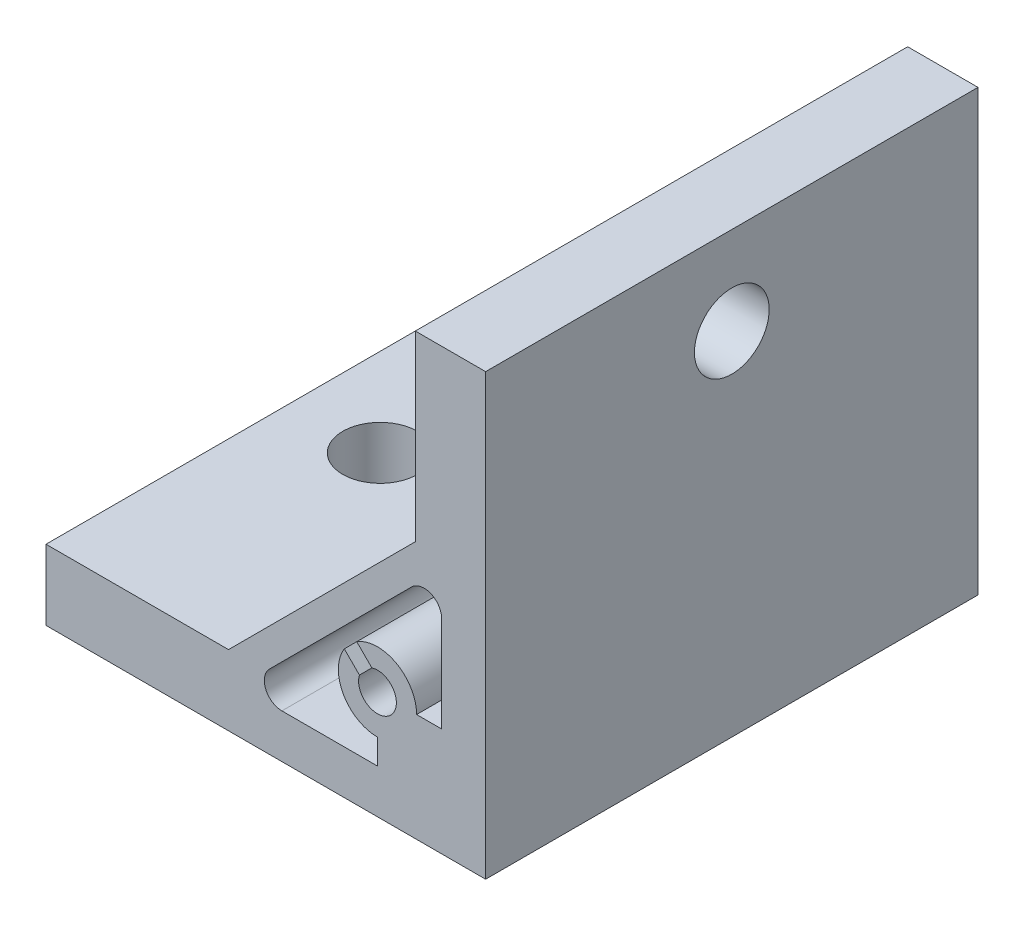
ISO-10303-21;
HEADER;
FILE_DESCRIPTION(('STEP AP214'),'2;1');
FILE_NAME('part.step','',(''),(''),'','','');
FILE_SCHEMA(('AUTOMOTIVE_DESIGN { 1 0 10303 214 1 1 1 1 }'));
ENDSEC;
DATA;
#1=APPLICATION_CONTEXT('core data for automotive mechanical design processes');
#2=APPLICATION_PROTOCOL_DEFINITION('international standard','automotive_design',2000,#1);
#3=PRODUCT_CONTEXT('',#1,'mechanical');
#4=PRODUCT('Part','Part','',(#3));
#5=PRODUCT_RELATED_PRODUCT_CATEGORY('part','',(#4));
#6=PRODUCT_DEFINITION_FORMATION('','',#4);
#7=PRODUCT_DEFINITION_CONTEXT('part definition',#1,'design');
#8=PRODUCT_DEFINITION('design','',#6,#7);
#9=PRODUCT_DEFINITION_SHAPE('','',#8);
#10=(LENGTH_UNIT() NAMED_UNIT(*) SI_UNIT(.MILLI.,.METRE.));
#11=(NAMED_UNIT(*) PLANE_ANGLE_UNIT() SI_UNIT($,.RADIAN.));
#12=(NAMED_UNIT(*) SI_UNIT($,.STERADIAN.) SOLID_ANGLE_UNIT());
#13=UNCERTAINTY_MEASURE_WITH_UNIT(LENGTH_MEASURE(1.E-05),#10,'distance_accuracy_value','');
#14=(GEOMETRIC_REPRESENTATION_CONTEXT(3) GLOBAL_UNCERTAINTY_ASSIGNED_CONTEXT((#13)) GLOBAL_UNIT_ASSIGNED_CONTEXT((#10,
#11,#12)) REPRESENTATION_CONTEXT('',''));
#15=CARTESIAN_POINT('',(0.,0.,0.));
#16=DIRECTION('',(0.,0.,1.));
#17=DIRECTION('',(1.,0.,0.));
#18=AXIS2_PLACEMENT_3D('',#15,#16,#17);
#19=CARTESIAN_POINT('',(50.,0.,28.));
#20=DIRECTION('',(-1.,0.,0.));
#21=DIRECTION('',(0.,0.,1.));
#22=AXIS2_PLACEMENT_3D('',#19,#20,#21);
#23=PLANE('',#22);
#24=DIRECTION('',(0.,1.,0.));
#25=VECTOR('',#24,1.);
#26=CARTESIAN_POINT('',(50.,0.,-28.));
#27=LINE('',#26,#25);
#28=CARTESIAN_POINT('',(50.,0.,-28.));
#29=VERTEX_POINT('',#28);
#30=CARTESIAN_POINT('',(50.,50.,-28.));
#31=VERTEX_POINT('',#30);
#32=EDGE_CURVE('E283',#29,#31,#27,.T.);
#33=ORIENTED_EDGE('',*,*,#32,.T.);
#34=DIRECTION('',(0.,0.,-1.));
#35=VECTOR('',#34,1.);
#36=CARTESIAN_POINT('',(50.,50.,28.));
#37=LINE('',#36,#35);
#38=CARTESIAN_POINT('',(50.,50.,28.));
#39=VERTEX_POINT('',#38);
#40=EDGE_CURVE('E303',#39,#31,#37,.T.);
#41=ORIENTED_EDGE('',*,*,#40,.F.);
#42=DIRECTION('',(0.,1.,0.));
#43=VECTOR('',#42,1.);
#44=CARTESIAN_POINT('',(50.,0.,28.));
#45=LINE('',#44,#43);
#46=CARTESIAN_POINT('',(50.,0.,28.));
#47=VERTEX_POINT('',#46);
#48=EDGE_CURVE('E268',#47,#39,#45,.T.);
#49=ORIENTED_EDGE('',*,*,#48,.F.);
#50=DIRECTION('',(0.,0.,-1.));
#51=VECTOR('',#50,1.);
#52=CARTESIAN_POINT('',(50.,0.,28.));
#53=LINE('',#52,#51);
#54=EDGE_CURVE('E43',#47,#29,#53,.T.);
#55=ORIENTED_EDGE('',*,*,#54,.T.);
#56=EDGE_LOOP('',(#33,#41,#49,#55));
#57=FACE_BOUND('',#56,.T.);
#58=CARTESIAN_POINT('',(50.0000000000001,40.,0.));
#59=DIRECTION('',(1.,0.,0.));
#60=DIRECTION('',(0.,0.,1.));
#61=AXIS2_PLACEMENT_3D('',#58,#59,#60);
#62=CIRCLE('',#61,4.25);
#63=CARTESIAN_POINT('',(50.0000000000001,40.,4.25));
#64=VERTEX_POINT('',#63);
#65=EDGE_CURVE('E369',#64,#64,#62,.T.);
#66=ORIENTED_EDGE('',*,*,#65,.F.);
#67=EDGE_LOOP('',(#66));
#68=FACE_BOUND('',#67,.T.);
#69=ADVANCED_FACE('F35',(#57,#68),#23,.F.);
#70=CARTESIAN_POINT('',(42.,29.2426406871192,28.));
#71=DIRECTION('',(1.,0.,0.));
#72=DIRECTION('',(0.,0.,-1.));
#73=AXIS2_PLACEMENT_3D('',#70,#71,#72);
#74=PLANE('',#73);
#75=DIRECTION('',(0.,-1.,0.));
#76=VECTOR('',#75,1.);
#77=CARTESIAN_POINT('',(42.,29.2426406871192,-28.));
#78=LINE('',#77,#76);
#79=CARTESIAN_POINT('',(42.,50.,-28.));
#80=VERTEX_POINT('',#79);
#81=CARTESIAN_POINT('',(42.,29.2426406871192,-28.));
#82=VERTEX_POINT('',#81);
#83=EDGE_CURVE('E287',#80,#82,#78,.T.);
#84=ORIENTED_EDGE('',*,*,#83,.T.);
#85=DIRECTION('',(0.,0.,-1.));
#86=VECTOR('',#85,1.);
#87=CARTESIAN_POINT('',(42.,29.2426406871192,28.));
#88=LINE('',#87,#86);
#89=CARTESIAN_POINT('',(42.,29.2426406871192,28.));
#90=VERTEX_POINT('',#89);
#91=EDGE_CURVE('E297',#90,#82,#88,.T.);
#92=ORIENTED_EDGE('',*,*,#91,.F.);
#93=DIRECTION('',(0.,-1.,0.));
#94=VECTOR('',#93,1.);
#95=CARTESIAN_POINT('',(42.,29.2426406871192,28.));
#96=LINE('',#95,#94);
#97=CARTESIAN_POINT('',(42.,50.,28.));
#98=VERTEX_POINT('',#97);
#99=EDGE_CURVE('E272',#98,#90,#96,.T.);
#100=ORIENTED_EDGE('',*,*,#99,.F.);
#101=DIRECTION('',(0.,0.,-1.));
#102=VECTOR('',#101,1.);
#103=CARTESIAN_POINT('',(42.,50.,28.));
#104=LINE('',#103,#102);
#105=EDGE_CURVE('E300',#98,#80,#104,.T.);
#106=ORIENTED_EDGE('',*,*,#105,.T.);
#107=EDGE_LOOP('',(#84,#92,#100,#106));
#108=FACE_BOUND('',#107,.T.);
#109=CARTESIAN_POINT('',(42.0000000000001,40.,0.));
#110=DIRECTION('',(1.,0.,0.));
#111=DIRECTION('',(0.,0.,1.));
#112=AXIS2_PLACEMENT_3D('',#109,#110,#111);
#113=CIRCLE('',#112,4.25);
#114=CARTESIAN_POINT('',(42.0000000000001,40.,4.25));
#115=VERTEX_POINT('',#114);
#116=EDGE_CURVE('E371',#115,#115,#113,.T.);
#117=ORIENTED_EDGE('',*,*,#116,.T.);
#118=EDGE_LOOP('',(#117));
#119=FACE_BOUND('',#118,.T.);
#120=ADVANCED_FACE('F326',(#108,#119),#74,.F.);
#121=CARTESIAN_POINT('',(0.,0.,28.));
#122=DIRECTION('',(0.,0.,1.));
#123=DIRECTION('',(1.,0.,0.));
#124=AXIS2_PLACEMENT_3D('',#121,#122,#123);
#125=PLANE('',#124);
#126=DIRECTION('',(0.,-1.,0.));
#127=VECTOR('',#126,1.);
#128=CARTESIAN_POINT('',(0.,8.,28.));
#129=LINE('',#128,#127);
#130=CARTESIAN_POINT('',(0.,8.,28.));
#131=VERTEX_POINT('',#130);
#132=CARTESIAN_POINT('',(0.,0.,28.));
#133=VERTEX_POINT('',#132);
#134=EDGE_CURVE('E262',#131,#133,#129,.T.);
#135=ORIENTED_EDGE('',*,*,#134,.T.);
#136=DIRECTION('',(1.,0.,0.));
#137=VECTOR('',#136,1.);
#138=CARTESIAN_POINT('',(0.,0.,28.));
#139=LINE('',#138,#137);
#140=EDGE_CURVE('E265',#133,#47,#139,.T.);
#141=ORIENTED_EDGE('',*,*,#140,.T.);
#142=ORIENTED_EDGE('',*,*,#48,.T.);
#143=DIRECTION('',(-1.,0.,0.));
#144=VECTOR('',#143,1.);
#145=CARTESIAN_POINT('',(42.,50.,28.));
#146=LINE('',#145,#144);
#147=EDGE_CURVE('E270',#39,#98,#146,.T.);
#148=ORIENTED_EDGE('',*,*,#147,.T.);
#149=ORIENTED_EDGE('',*,*,#99,.T.);
#150=DIRECTION('',(-0.707106781186546,-0.707106781186549,0.));
#151=VECTOR('',#150,1.);
#152=CARTESIAN_POINT('',(20.7573593128809,8.,28.));
#153=LINE('',#152,#151);
#154=CARTESIAN_POINT('',(20.7573593128809,8.,28.));
#155=VERTEX_POINT('',#154);
#156=EDGE_CURVE('E274',#90,#155,#153,.T.);
#157=ORIENTED_EDGE('',*,*,#156,.T.);
#158=DIRECTION('',(-1.,0.,0.));
#159=VECTOR('',#158,1.);
#160=CARTESIAN_POINT('',(0.,8.,28.));
#161=LINE('',#160,#159);
#162=EDGE_CURVE('E276',#155,#131,#161,.T.);
#163=ORIENTED_EDGE('',*,*,#162,.T.);
#164=EDGE_LOOP('',(#135,#141,#142,#148,#149,#157,#163));
#165=FACE_BOUND('',#164,.T.);
#166=DIRECTION('',(0.707106781186549,-0.707106781186546,0.));
#167=VECTOR('',#166,1.);
#168=CARTESIAN_POINT('',(35.647066335444,12.9387201021829,28.));
#169=LINE('',#168,#167);
#170=CARTESIAN_POINT('',(33.9267474297161,14.6590390079109,28.));
#171=VERTEX_POINT('',#170);
#172=CARTESIAN_POINT('',(35.647066335444,12.9387201021829,28.));
#173=VERTEX_POINT('',#172);
#174=EDGE_CURVE('E174',#171,#173,#169,.T.);
#175=ORIENTED_EDGE('',*,*,#174,.F.);
#176=CARTESIAN_POINT('',(37.7,12.3,28.));
#177=DIRECTION('',(0.,0.,-1.));
#178=DIRECTION('',(1.,0.,0.));
#179=AXIS2_PLACEMENT_3D('',#176,#177,#178);
#180=CIRCLE('',#179,4.45);
#181=CARTESIAN_POINT('',(37.7,7.84999999999995,28.));
#182=VERTEX_POINT('',#181);
#183=EDGE_CURVE('E166',#182,#171,#180,.T.);
#184=ORIENTED_EDGE('',*,*,#183,.F.);
#185=DIRECTION('',(0.,1.,0.));
#186=VECTOR('',#185,1.);
#187=CARTESIAN_POINT('',(37.7,5.,28.));
#188=LINE('',#187,#186);
#189=CARTESIAN_POINT('',(37.7,5.,28.));
#190=VERTEX_POINT('',#189);
#191=EDGE_CURVE('E209',#190,#182,#188,.T.);
#192=ORIENTED_EDGE('',*,*,#191,.F.);
#193=DIRECTION('',(1.,0.,0.));
#194=VECTOR('',#193,1.);
#195=CARTESIAN_POINT('',(26.828427124746,5.,28.));
#196=LINE('',#195,#194);
#197=CARTESIAN_POINT('',(26.828427124746,4.99999999999993,28.));
#198=VERTEX_POINT('',#197);
#199=EDGE_CURVE('E207',#198,#190,#196,.T.);
#200=ORIENTED_EDGE('',*,*,#199,.F.);
#201=CARTESIAN_POINT('',(26.8284271247464,7.00000000000011,28.));
#202=DIRECTION('',(0.,0.,1.));
#203=DIRECTION('',(1.,0.,0.));
#204=AXIS2_PLACEMENT_3D('',#201,#202,#203);
#205=CIRCLE('',#204,2.00000000000019);
#206=CARTESIAN_POINT('',(25.4142135623729,8.41421356237311,28.));
#207=VERTEX_POINT('',#206);
#208=EDGE_CURVE('E205',#207,#198,#205,.T.);
#209=ORIENTED_EDGE('',*,*,#208,.F.);
#210=DIRECTION('',(-0.70710678118655,-0.707106781186545,0.));
#211=VECTOR('',#210,1.);
#212=CARTESIAN_POINT('',(25.4142135623729,8.41421356237311,28.));
#213=LINE('',#212,#211);
#214=CARTESIAN_POINT('',(41.585786437627,24.5857864376269,28.));
#215=VERTEX_POINT('',#214);
#216=EDGE_CURVE('E203',#215,#207,#213,.T.);
#217=ORIENTED_EDGE('',*,*,#216,.F.);
#218=CARTESIAN_POINT('',(43.0000000000002,23.171572875254,28.));
#219=DIRECTION('',(0.,0.,1.));
#220=DIRECTION('',(1.,0.,0.));
#221=AXIS2_PLACEMENT_3D('',#218,#219,#220);
#222=CIRCLE('',#221,1.99999999999993);
#223=CARTESIAN_POINT('',(45.,23.1715728752539,28.));
#224=VERTEX_POINT('',#223);
#225=EDGE_CURVE('E201',#224,#215,#222,.T.);
#226=ORIENTED_EDGE('',*,*,#225,.F.);
#227=DIRECTION('',(0.,1.,0.));
#228=VECTOR('',#227,1.);
#229=CARTESIAN_POINT('',(45.,23.1715728752539,28.));
#230=LINE('',#229,#228);
#231=CARTESIAN_POINT('',(45.,12.3,28.));
#232=VERTEX_POINT('',#231);
#233=EDGE_CURVE('E199',#232,#224,#230,.T.);
#234=ORIENTED_EDGE('',*,*,#233,.F.);
#235=DIRECTION('',(1.,0.,0.));
#236=VECTOR('',#235,1.);
#237=CARTESIAN_POINT('',(42.15,12.3,28.));
#238=LINE('',#237,#236);
#239=CARTESIAN_POINT('',(42.15,12.3,28.));
#240=VERTEX_POINT('',#239);
#241=EDGE_CURVE('E197',#240,#232,#238,.T.);
#242=ORIENTED_EDGE('',*,*,#241,.F.);
#243=CARTESIAN_POINT('',(37.7,12.3,28.));
#244=DIRECTION('',(0.,0.,-1.));
#245=DIRECTION('',(1.,0.,0.));
#246=AXIS2_PLACEMENT_3D('',#243,#244,#245);
#247=CIRCLE('',#246,4.45);
#248=CARTESIAN_POINT('',(35.3409609920885,16.0732525702836,28.));
#249=VERTEX_POINT('',#248);
#250=EDGE_CURVE('E195',#249,#240,#247,.T.);
#251=ORIENTED_EDGE('',*,*,#250,.F.);
#252=DIRECTION('',(-0.707106781186684,0.707106781186411,0.));
#253=VECTOR('',#252,1.);
#254=CARTESIAN_POINT('',(37.0612798978168,14.3529336645559,28.));
#255=LINE('',#254,#253);
#256=CARTESIAN_POINT('',(37.0612798978168,14.3529336645559,28.));
#257=VERTEX_POINT('',#256);
#258=EDGE_CURVE('E190',#257,#249,#255,.T.);
#259=ORIENTED_EDGE('',*,*,#258,.F.);
#260=CARTESIAN_POINT('',(37.7,12.3,28.));
#261=DIRECTION('',(0.,0.,1.));
#262=DIRECTION('',(1.,0.,0.));
#263=AXIS2_PLACEMENT_3D('',#260,#261,#262);
#264=CIRCLE('',#263,2.15);
#265=EDGE_CURVE('E188',#173,#257,#264,.T.);
#266=ORIENTED_EDGE('',*,*,#265,.F.);
#267=EDGE_LOOP('',(#175,#184,#192,#200,#209,#217,#226,#234,#242,#251,#259,#266));
#268=FACE_BOUND('',#267,.T.);
#269=ADVANCED_FACE('F186',(#165,#268),#125,.T.);
#270=CARTESIAN_POINT('',(0.,0.,-28.));
#271=DIRECTION('',(0.,0.,1.));
#272=DIRECTION('',(1.,0.,0.));
#273=AXIS2_PLACEMENT_3D('',#270,#271,#272);
#274=PLANE('',#273);
#275=DIRECTION('',(0.,-1.,0.));
#276=VECTOR('',#275,1.);
#277=CARTESIAN_POINT('',(0.,8.,-28.));
#278=LINE('',#277,#276);
#279=CARTESIAN_POINT('',(0.,8.,-28.));
#280=VERTEX_POINT('',#279);
#281=CARTESIAN_POINT('',(0.,0.,-28.));
#282=VERTEX_POINT('',#281);
#283=EDGE_CURVE('E182',#280,#282,#278,.T.);
#284=ORIENTED_EDGE('',*,*,#283,.F.);
#285=DIRECTION('',(-1.,0.,0.));
#286=VECTOR('',#285,1.);
#287=CARTESIAN_POINT('',(0.,8.,-28.));
#288=LINE('',#287,#286);
#289=CARTESIAN_POINT('',(20.7573593128809,8.,-28.));
#290=VERTEX_POINT('',#289);
#291=EDGE_CURVE('E266',#290,#280,#288,.T.);
#292=ORIENTED_EDGE('',*,*,#291,.F.);
#293=DIRECTION('',(-0.707106781186546,-0.707106781186549,0.));
#294=VECTOR('',#293,1.);
#295=CARTESIAN_POINT('',(20.7573593128809,8.,-28.));
#296=LINE('',#295,#294);
#297=EDGE_CURVE('E289',#82,#290,#296,.T.);
#298=ORIENTED_EDGE('',*,*,#297,.F.);
#299=ORIENTED_EDGE('',*,*,#83,.F.);
#300=DIRECTION('',(-1.,0.,0.));
#301=VECTOR('',#300,1.);
#302=CARTESIAN_POINT('',(42.,50.,-28.));
#303=LINE('',#302,#301);
#304=EDGE_CURVE('E285',#31,#80,#303,.T.);
#305=ORIENTED_EDGE('',*,*,#304,.F.);
#306=ORIENTED_EDGE('',*,*,#32,.F.);
#307=DIRECTION('',(1.,0.,0.));
#308=VECTOR('',#307,1.);
#309=CARTESIAN_POINT('',(0.,0.,-28.));
#310=LINE('',#309,#308);
#311=EDGE_CURVE('E281',#282,#29,#310,.T.);
#312=ORIENTED_EDGE('',*,*,#311,.F.);
#313=EDGE_LOOP('',(#284,#292,#298,#299,#305,#306,#312));
#314=FACE_BOUND('',#313,.T.);
#315=CARTESIAN_POINT('',(37.7,12.3,-28.));
#316=DIRECTION('',(0.,0.,-1.));
#317=DIRECTION('',(1.,0.,0.));
#318=AXIS2_PLACEMENT_3D('',#315,#316,#317);
#319=CIRCLE('',#318,4.45);
#320=CARTESIAN_POINT('',(37.7,7.84999999999995,-28.));
#321=VERTEX_POINT('',#320);
#322=CARTESIAN_POINT('',(33.9267474297161,14.6590390079109,-28.));
#323=VERTEX_POINT('',#322);
#324=EDGE_CURVE('E58',#321,#323,#319,.T.);
#325=ORIENTED_EDGE('',*,*,#324,.T.);
#326=DIRECTION('',(0.707106781186549,-0.707106781186546,0.));
#327=VECTOR('',#326,1.);
#328=CARTESIAN_POINT('',(35.647066335444,12.9387201021829,-28.));
#329=LINE('',#328,#327);
#330=CARTESIAN_POINT('',(35.647066335444,12.9387201021829,-28.));
#331=VERTEX_POINT('',#330);
#332=EDGE_CURVE('E181',#323,#331,#329,.T.);
#333=ORIENTED_EDGE('',*,*,#332,.T.);
#334=CARTESIAN_POINT('',(37.7,12.3,-28.));
#335=DIRECTION('',(0.,0.,1.));
#336=DIRECTION('',(1.,0.,0.));
#337=AXIS2_PLACEMENT_3D('',#334,#335,#336);
#338=CIRCLE('',#337,2.15);
#339=CARTESIAN_POINT('',(37.0612798978168,14.3529336645559,-28.));
#340=VERTEX_POINT('',#339);
#341=EDGE_CURVE('E214',#331,#340,#338,.T.);
#342=ORIENTED_EDGE('',*,*,#341,.T.);
#343=DIRECTION('',(-0.707106781186684,0.707106781186411,0.));
#344=VECTOR('',#343,1.);
#345=CARTESIAN_POINT('',(37.0612798978168,14.3529336645559,-28.));
#346=LINE('',#345,#344);
#347=CARTESIAN_POINT('',(35.3409609920885,16.0732525702836,-28.));
#348=VERTEX_POINT('',#347);
#349=EDGE_CURVE('E217',#340,#348,#346,.T.);
#350=ORIENTED_EDGE('',*,*,#349,.T.);
#351=CARTESIAN_POINT('',(37.7,12.3,-28.));
#352=DIRECTION('',(0.,0.,-1.));
#353=DIRECTION('',(1.,0.,0.));
#354=AXIS2_PLACEMENT_3D('',#351,#352,#353);
#355=CIRCLE('',#354,4.45);
#356=CARTESIAN_POINT('',(42.15,12.3,-28.));
#357=VERTEX_POINT('',#356);
#358=EDGE_CURVE('E220',#348,#357,#355,.T.);
#359=ORIENTED_EDGE('',*,*,#358,.T.);
#360=DIRECTION('',(1.,0.,0.));
#361=VECTOR('',#360,1.);
#362=CARTESIAN_POINT('',(42.15,12.3,-28.));
#363=LINE('',#362,#361);
#364=CARTESIAN_POINT('',(45.,12.3,-28.));
#365=VERTEX_POINT('',#364);
#366=EDGE_CURVE('E223',#357,#365,#363,.T.);
#367=ORIENTED_EDGE('',*,*,#366,.T.);
#368=DIRECTION('',(0.,1.,0.));
#369=VECTOR('',#368,1.);
#370=CARTESIAN_POINT('',(45.,23.1715728752539,-28.));
#371=LINE('',#370,#369);
#372=CARTESIAN_POINT('',(45.,23.1715728752539,-28.));
#373=VERTEX_POINT('',#372);
#374=EDGE_CURVE('E226',#365,#373,#371,.T.);
#375=ORIENTED_EDGE('',*,*,#374,.T.);
#376=CARTESIAN_POINT('',(43.0000000000002,23.171572875254,-28.));
#377=DIRECTION('',(0.,0.,1.));
#378=DIRECTION('',(1.,0.,0.));
#379=AXIS2_PLACEMENT_3D('',#376,#377,#378);
#380=CIRCLE('',#379,1.99999999999993);
#381=CARTESIAN_POINT('',(41.585786437627,24.5857864376269,-28.));
#382=VERTEX_POINT('',#381);
#383=EDGE_CURVE('E229',#373,#382,#380,.T.);
#384=ORIENTED_EDGE('',*,*,#383,.T.);
#385=DIRECTION('',(-0.70710678118655,-0.707106781186545,0.));
#386=VECTOR('',#385,1.);
#387=CARTESIAN_POINT('',(25.4142135623729,8.41421356237311,-28.));
#388=LINE('',#387,#386);
#389=CARTESIAN_POINT('',(25.4142135623729,8.41421356237311,-28.));
#390=VERTEX_POINT('',#389);
#391=EDGE_CURVE('E232',#382,#390,#388,.T.);
#392=ORIENTED_EDGE('',*,*,#391,.T.);
#393=CARTESIAN_POINT('',(26.8284271247464,7.00000000000011,-28.));
#394=DIRECTION('',(0.,0.,1.));
#395=DIRECTION('',(1.,0.,0.));
#396=AXIS2_PLACEMENT_3D('',#393,#394,#395);
#397=CIRCLE('',#396,2.00000000000019);
#398=CARTESIAN_POINT('',(26.828427124746,4.99999999999993,-28.));
#399=VERTEX_POINT('',#398);
#400=EDGE_CURVE('E235',#390,#399,#397,.T.);
#401=ORIENTED_EDGE('',*,*,#400,.T.);
#402=DIRECTION('',(1.,0.,0.));
#403=VECTOR('',#402,1.);
#404=CARTESIAN_POINT('',(26.828427124746,5.,-28.));
#405=LINE('',#404,#403);
#406=CARTESIAN_POINT('',(37.7,5.,-28.));
#407=VERTEX_POINT('',#406);
#408=EDGE_CURVE('E238',#399,#407,#405,.T.);
#409=ORIENTED_EDGE('',*,*,#408,.T.);
#410=DIRECTION('',(0.,1.,0.));
#411=VECTOR('',#410,1.);
#412=CARTESIAN_POINT('',(37.7,5.,-28.));
#413=LINE('',#412,#411);
#414=EDGE_CURVE('E175',#407,#321,#413,.T.);
#415=ORIENTED_EDGE('',*,*,#414,.T.);
#416=EDGE_LOOP('',(#325,#333,#342,#350,#359,#367,#375,#384,#392,#401,#409,#415));
#417=FACE_BOUND('',#416,.T.);
#418=ADVANCED_FACE('F316',(#314,#417),#274,.F.);
#419=CARTESIAN_POINT('',(0.,8.,28.));
#420=DIRECTION('',(1.,0.,0.));
#421=DIRECTION('',(0.,0.,-1.));
#422=AXIS2_PLACEMENT_3D('',#419,#420,#421);
#423=PLANE('',#422);
#424=ORIENTED_EDGE('',*,*,#283,.T.);
#425=DIRECTION('',(0.,0.,-1.));
#426=VECTOR('',#425,1.);
#427=CARTESIAN_POINT('',(0.,0.,28.));
#428=LINE('',#427,#426);
#429=EDGE_CURVE('E11',#133,#282,#428,.T.);
#430=ORIENTED_EDGE('',*,*,#429,.F.);
#431=ORIENTED_EDGE('',*,*,#134,.F.);
#432=DIRECTION('',(0.,0.,-1.));
#433=VECTOR('',#432,1.);
#434=CARTESIAN_POINT('',(0.,8.,28.));
#435=LINE('',#434,#433);
#436=EDGE_CURVE('E278',#131,#280,#435,.T.);
#437=ORIENTED_EDGE('',*,*,#436,.T.);
#438=EDGE_LOOP('',(#424,#430,#431,#437));
#439=FACE_BOUND('',#438,.T.);
#440=ADVANCED_FACE('F37',(#439),#423,.F.);
#441=CARTESIAN_POINT('',(0.,0.,28.));
#442=DIRECTION('',(0.,1.,0.));
#443=DIRECTION('',(0.,0.,1.));
#444=AXIS2_PLACEMENT_3D('',#441,#442,#443);
#445=PLANE('',#444);
#446=CARTESIAN_POINT('',(10.,0.,0.));
#447=DIRECTION('',(0.,1.,0.));
#448=DIRECTION('',(0.,0.,1.));
#449=AXIS2_PLACEMENT_3D('',#446,#447,#448);
#450=CIRCLE('',#449,4.25);
#451=CARTESIAN_POINT('',(10.,0.,4.25));
#452=VERTEX_POINT('',#451);
#453=EDGE_CURVE('E212',#452,#452,#450,.T.);
#454=ORIENTED_EDGE('',*,*,#453,.T.);
#455=EDGE_LOOP('',(#454));
#456=FACE_BOUND('',#455,.T.);
#457=ORIENTED_EDGE('',*,*,#311,.T.);
#458=ORIENTED_EDGE('',*,*,#54,.F.);
#459=ORIENTED_EDGE('',*,*,#140,.F.);
#460=ORIENTED_EDGE('',*,*,#429,.T.);
#461=EDGE_LOOP('',(#457,#458,#459,#460));
#462=FACE_BOUND('',#461,.T.);
#463=ADVANCED_FACE('F334',(#456,#462),#445,.F.);
#464=CARTESIAN_POINT('',(42.,50.,28.));
#465=DIRECTION('',(0.,-1.,0.));
#466=DIRECTION('',(0.,0.,-1.));
#467=AXIS2_PLACEMENT_3D('',#464,#465,#466);
#468=PLANE('',#467);
#469=ORIENTED_EDGE('',*,*,#304,.T.);
#470=ORIENTED_EDGE('',*,*,#105,.F.);
#471=ORIENTED_EDGE('',*,*,#147,.F.);
#472=ORIENTED_EDGE('',*,*,#40,.T.);
#473=EDGE_LOOP('',(#469,#470,#471,#472));
#474=FACE_BOUND('',#473,.T.);
#475=ADVANCED_FACE('F322',(#474),#468,.F.);
#476=CARTESIAN_POINT('',(20.7573593128809,8.,28.));
#477=DIRECTION('',(0.707106781186549,-0.707106781186546,0.));
#478=DIRECTION('',(0.707106781186546,0.707106781186549,0.));
#479=AXIS2_PLACEMENT_3D('',#476,#477,#478);
#480=PLANE('',#479);
#481=ORIENTED_EDGE('',*,*,#297,.T.);
#482=DIRECTION('',(0.,0.,-1.));
#483=VECTOR('',#482,1.);
#484=CARTESIAN_POINT('',(20.7573593128809,8.,28.));
#485=LINE('',#484,#483);
#486=EDGE_CURVE('E294',#155,#290,#485,.T.);
#487=ORIENTED_EDGE('',*,*,#486,.F.);
#488=ORIENTED_EDGE('',*,*,#156,.F.);
#489=ORIENTED_EDGE('',*,*,#91,.T.);
#490=EDGE_LOOP('',(#481,#487,#488,#489));
#491=FACE_BOUND('',#490,.T.);
#492=ADVANCED_FACE('F342',(#491),#480,.F.);
#493=CARTESIAN_POINT('',(0.,8.,28.));
#494=DIRECTION('',(0.,-1.,0.));
#495=DIRECTION('',(0.,0.,-1.));
#496=AXIS2_PLACEMENT_3D('',#493,#494,#495);
#497=PLANE('',#496);
#498=CARTESIAN_POINT('',(10.,8.,0.));
#499=DIRECTION('',(0.,1.,0.));
#500=DIRECTION('',(0.,0.,1.));
#501=AXIS2_PLACEMENT_3D('',#498,#499,#500);
#502=CIRCLE('',#501,4.25);
#503=CARTESIAN_POINT('',(10.,8.,4.25));
#504=VERTEX_POINT('',#503);
#505=EDGE_CURVE('E366',#504,#504,#502,.T.);
#506=ORIENTED_EDGE('',*,*,#505,.F.);
#507=EDGE_LOOP('',(#506));
#508=FACE_BOUND('',#507,.T.);
#509=ORIENTED_EDGE('',*,*,#291,.T.);
#510=ORIENTED_EDGE('',*,*,#436,.F.);
#511=ORIENTED_EDGE('',*,*,#162,.F.);
#512=ORIENTED_EDGE('',*,*,#486,.T.);
#513=EDGE_LOOP('',(#509,#510,#511,#512));
#514=FACE_BOUND('',#513,.T.);
#515=ADVANCED_FACE('F339',(#508,#514),#497,.F.);
#516=CARTESIAN_POINT('',(37.7,12.3,28.));
#517=DIRECTION('',(0.,0.,-1.));
#518=DIRECTION('',(-1.,0.,0.));
#519=AXIS2_PLACEMENT_3D('',#516,#517,#518);
#520=CYLINDRICAL_SURFACE('',#519,4.45);
#521=ORIENTED_EDGE('',*,*,#324,.F.);
#522=DIRECTION('',(0.,0.,-1.));
#523=VECTOR('',#522,1.);
#524=CARTESIAN_POINT('',(37.7,7.84999999999995,28.));
#525=LINE('',#524,#523);
#526=EDGE_CURVE('E170',#182,#321,#525,.T.);
#527=ORIENTED_EDGE('',*,*,#526,.F.);
#528=ORIENTED_EDGE('',*,*,#183,.T.);
#529=DIRECTION('',(0.,0.,-1.));
#530=VECTOR('',#529,1.);
#531=CARTESIAN_POINT('',(33.9267474297161,14.6590390079109,28.));
#532=LINE('',#531,#530);
#533=EDGE_CURVE('E169',#171,#323,#532,.T.);
#534=ORIENTED_EDGE('',*,*,#533,.T.);
#535=EDGE_LOOP('',(#521,#527,#528,#534));
#536=FACE_BOUND('',#535,.T.);
#537=ADVANCED_FACE('F168',(#536),#520,.T.);
#538=CARTESIAN_POINT('',(35.647066335444,12.9387201021829,28.));
#539=DIRECTION('',(0.707106781186546,0.707106781186549,0.));
#540=DIRECTION('',(-0.707106781186549,0.707106781186546,0.));
#541=AXIS2_PLACEMENT_3D('',#538,#539,#540);
#542=PLANE('',#541);
#543=ORIENTED_EDGE('',*,*,#332,.F.);
#544=ORIENTED_EDGE('',*,*,#533,.F.);
#545=ORIENTED_EDGE('',*,*,#174,.T.);
#546=DIRECTION('',(0.,0.,-1.));
#547=VECTOR('',#546,1.);
#548=CARTESIAN_POINT('',(35.647066335444,12.9387201021829,28.));
#549=LINE('',#548,#547);
#550=EDGE_CURVE('E183',#173,#331,#549,.T.);
#551=ORIENTED_EDGE('',*,*,#550,.T.);
#552=EDGE_LOOP('',(#543,#544,#545,#551));
#553=FACE_BOUND('',#552,.T.);
#554=ADVANCED_FACE('F178',(#553),#542,.T.);
#555=CARTESIAN_POINT('',(37.7,12.3,28.));
#556=DIRECTION('',(0.,0.,-1.));
#557=DIRECTION('',(-1.,0.,0.));
#558=AXIS2_PLACEMENT_3D('',#555,#556,#557);
#559=CYLINDRICAL_SURFACE('',#558,2.15);
#560=ORIENTED_EDGE('',*,*,#341,.F.);
#561=ORIENTED_EDGE('',*,*,#550,.F.);
#562=ORIENTED_EDGE('',*,*,#265,.T.);
#563=DIRECTION('',(0.,0.,-1.));
#564=VECTOR('',#563,1.);
#565=CARTESIAN_POINT('',(37.0612798978168,14.3529336645559,28.));
#566=LINE('',#565,#564);
#567=EDGE_CURVE('E259',#257,#340,#566,.T.);
#568=ORIENTED_EDGE('',*,*,#567,.T.);
#569=EDGE_LOOP('',(#560,#561,#562,#568));
#570=FACE_BOUND('',#569,.T.);
#571=ADVANCED_FACE('F422',(#570),#559,.F.);
#572=CARTESIAN_POINT('',(37.0612798978168,14.3529336645559,28.));
#573=DIRECTION('',(-0.707106781186411,-0.707106781186684,0.));
#574=DIRECTION('',(0.707106781186684,-0.707106781186411,0.));
#575=AXIS2_PLACEMENT_3D('',#572,#573,#574);
#576=PLANE('',#575);
#577=ORIENTED_EDGE('',*,*,#349,.F.);
#578=ORIENTED_EDGE('',*,*,#567,.F.);
#579=ORIENTED_EDGE('',*,*,#258,.T.);
#580=DIRECTION('',(0.,0.,-1.));
#581=VECTOR('',#580,1.);
#582=CARTESIAN_POINT('',(35.3409609920885,16.0732525702836,28.));
#583=LINE('',#582,#581);
#584=EDGE_CURVE('E257',#249,#348,#583,.T.);
#585=ORIENTED_EDGE('',*,*,#584,.T.);
#586=EDGE_LOOP('',(#577,#578,#579,#585));
#587=FACE_BOUND('',#586,.T.);
#588=ADVANCED_FACE('F418',(#587),#576,.T.);
#589=CARTESIAN_POINT('',(37.7,12.3,28.));
#590=DIRECTION('',(0.,0.,-1.));
#591=DIRECTION('',(-1.,0.,0.));
#592=AXIS2_PLACEMENT_3D('',#589,#590,#591);
#593=CYLINDRICAL_SURFACE('',#592,4.45);
#594=ORIENTED_EDGE('',*,*,#358,.F.);
#595=ORIENTED_EDGE('',*,*,#584,.F.);
#596=ORIENTED_EDGE('',*,*,#250,.T.);
#597=DIRECTION('',(0.,0.,-1.));
#598=VECTOR('',#597,1.);
#599=CARTESIAN_POINT('',(42.15,12.3,28.));
#600=LINE('',#599,#598);
#601=EDGE_CURVE('E255',#240,#357,#600,.T.);
#602=ORIENTED_EDGE('',*,*,#601,.T.);
#603=EDGE_LOOP('',(#594,#595,#596,#602));
#604=FACE_BOUND('',#603,.T.);
#605=ADVANCED_FACE('F414',(#604),#593,.T.);
#606=CARTESIAN_POINT('',(42.15,12.3,28.));
#607=DIRECTION('',(0.,1.,0.));
#608=DIRECTION('',(0.,0.,1.));
#609=AXIS2_PLACEMENT_3D('',#606,#607,#608);
#610=PLANE('',#609);
#611=ORIENTED_EDGE('',*,*,#366,.F.);
#612=ORIENTED_EDGE('',*,*,#601,.F.);
#613=ORIENTED_EDGE('',*,*,#241,.T.);
#614=DIRECTION('',(0.,0.,-1.));
#615=VECTOR('',#614,1.);
#616=CARTESIAN_POINT('',(45.,12.3,28.));
#617=LINE('',#616,#615);
#618=EDGE_CURVE('E253',#232,#365,#617,.T.);
#619=ORIENTED_EDGE('',*,*,#618,.T.);
#620=EDGE_LOOP('',(#611,#612,#613,#619));
#621=FACE_BOUND('',#620,.T.);
#622=ADVANCED_FACE('F410',(#621),#610,.T.);
#623=CARTESIAN_POINT('',(45.,23.1715728752539,28.));
#624=DIRECTION('',(-1.,0.,0.));
#625=DIRECTION('',(0.,0.,1.));
#626=AXIS2_PLACEMENT_3D('',#623,#624,#625);
#627=PLANE('',#626);
#628=ORIENTED_EDGE('',*,*,#374,.F.);
#629=ORIENTED_EDGE('',*,*,#618,.F.);
#630=ORIENTED_EDGE('',*,*,#233,.T.);
#631=DIRECTION('',(0.,0.,-1.));
#632=VECTOR('',#631,1.);
#633=CARTESIAN_POINT('',(45.,23.1715728752539,28.));
#634=LINE('',#633,#632);
#635=EDGE_CURVE('E251',#224,#373,#634,.T.);
#636=ORIENTED_EDGE('',*,*,#635,.T.);
#637=EDGE_LOOP('',(#628,#629,#630,#636));
#638=FACE_BOUND('',#637,.T.);
#639=ADVANCED_FACE('F406',(#638),#627,.T.);
#640=CARTESIAN_POINT('',(43.0000000000002,23.171572875254,28.));
#641=DIRECTION('',(0.,0.,-1.));
#642=DIRECTION('',(-1.,0.,0.));
#643=AXIS2_PLACEMENT_3D('',#640,#641,#642);
#644=CYLINDRICAL_SURFACE('',#643,1.99999999999993);
#645=ORIENTED_EDGE('',*,*,#383,.F.);
#646=ORIENTED_EDGE('',*,*,#635,.F.);
#647=ORIENTED_EDGE('',*,*,#225,.T.);
#648=DIRECTION('',(0.,0.,-1.));
#649=VECTOR('',#648,1.);
#650=CARTESIAN_POINT('',(41.585786437627,24.5857864376269,28.));
#651=LINE('',#650,#649);
#652=EDGE_CURVE('E249',#215,#382,#651,.T.);
#653=ORIENTED_EDGE('',*,*,#652,.T.);
#654=EDGE_LOOP('',(#645,#646,#647,#653));
#655=FACE_BOUND('',#654,.T.);
#656=ADVANCED_FACE('F402',(#655),#644,.F.);
#657=CARTESIAN_POINT('',(25.4142135623729,8.41421356237311,28.));
#658=DIRECTION('',(0.707106781186545,-0.70710678118655,0.));
#659=DIRECTION('',(0.70710678118655,0.707106781186545,0.));
#660=AXIS2_PLACEMENT_3D('',#657,#658,#659);
#661=PLANE('',#660);
#662=ORIENTED_EDGE('',*,*,#391,.F.);
#663=ORIENTED_EDGE('',*,*,#652,.F.);
#664=ORIENTED_EDGE('',*,*,#216,.T.);
#665=DIRECTION('',(0.,0.,-1.));
#666=VECTOR('',#665,1.);
#667=CARTESIAN_POINT('',(25.4142135623729,8.41421356237311,28.));
#668=LINE('',#667,#666);
#669=EDGE_CURVE('E247',#207,#390,#668,.T.);
#670=ORIENTED_EDGE('',*,*,#669,.T.);
#671=EDGE_LOOP('',(#662,#663,#664,#670));
#672=FACE_BOUND('',#671,.T.);
#673=ADVANCED_FACE('F398',(#672),#661,.T.);
#674=CARTESIAN_POINT('',(26.8284271247464,7.00000000000011,28.));
#675=DIRECTION('',(0.,0.,-1.));
#676=DIRECTION('',(-1.,0.,0.));
#677=AXIS2_PLACEMENT_3D('',#674,#675,#676);
#678=CYLINDRICAL_SURFACE('',#677,2.00000000000019);
#679=ORIENTED_EDGE('',*,*,#400,.F.);
#680=ORIENTED_EDGE('',*,*,#669,.F.);
#681=ORIENTED_EDGE('',*,*,#208,.T.);
#682=DIRECTION('',(0.,0.,-1.));
#683=VECTOR('',#682,1.);
#684=CARTESIAN_POINT('',(26.828427124746,4.99999999999993,28.));
#685=LINE('',#684,#683);
#686=EDGE_CURVE('E245',#198,#399,#685,.T.);
#687=ORIENTED_EDGE('',*,*,#686,.T.);
#688=EDGE_LOOP('',(#679,#680,#681,#687));
#689=FACE_BOUND('',#688,.T.);
#690=ADVANCED_FACE('F394',(#689),#678,.F.);
#691=CARTESIAN_POINT('',(26.828427124746,5.,28.));
#692=DIRECTION('',(0.,1.,0.));
#693=DIRECTION('',(0.,0.,1.));
#694=AXIS2_PLACEMENT_3D('',#691,#692,#693);
#695=PLANE('',#694);
#696=ORIENTED_EDGE('',*,*,#408,.F.);
#697=ORIENTED_EDGE('',*,*,#686,.F.);
#698=ORIENTED_EDGE('',*,*,#199,.T.);
#699=DIRECTION('',(0.,0.,-1.));
#700=VECTOR('',#699,1.);
#701=CARTESIAN_POINT('',(37.7,5.,28.));
#702=LINE('',#701,#700);
#703=EDGE_CURVE('E50',#190,#407,#702,.T.);
#704=ORIENTED_EDGE('',*,*,#703,.T.);
#705=EDGE_LOOP('',(#696,#697,#698,#704));
#706=FACE_BOUND('',#705,.T.);
#707=ADVANCED_FACE('F391',(#706),#695,.T.);
#708=CARTESIAN_POINT('',(37.7,5.,28.));
#709=DIRECTION('',(-1.,0.,0.));
#710=DIRECTION('',(0.,0.,1.));
#711=AXIS2_PLACEMENT_3D('',#708,#709,#710);
#712=PLANE('',#711);
#713=ORIENTED_EDGE('',*,*,#414,.F.);
#714=ORIENTED_EDGE('',*,*,#703,.F.);
#715=ORIENTED_EDGE('',*,*,#191,.T.);
#716=ORIENTED_EDGE('',*,*,#526,.T.);
#717=EDGE_LOOP('',(#713,#714,#715,#716));
#718=FACE_BOUND('',#717,.T.);
#719=ADVANCED_FACE('F386',(#718),#712,.T.);
#720=CARTESIAN_POINT('',(10.,0.,0.));
#721=DIRECTION('',(0.,1.,0.));
#722=DIRECTION('',(0.,0.,1.));
#723=AXIS2_PLACEMENT_3D('',#720,#721,#722);
#724=CYLINDRICAL_SURFACE('',#723,4.25);
#725=ORIENTED_EDGE('',*,*,#453,.F.);
#726=EDGE_LOOP('',(#725));
#727=FACE_BOUND('',#726,.T.);
#728=ORIENTED_EDGE('',*,*,#505,.T.);
#729=EDGE_LOOP('',(#728));
#730=FACE_BOUND('',#729,.T.);
#731=ADVANCED_FACE('F380',(#727,#730),#724,.F.);
#732=CARTESIAN_POINT('',(50.0000000000001,40.,0.));
#733=DIRECTION('',(-1.,0.,0.));
#734=DIRECTION('',(0.,-1.,0.));
#735=AXIS2_PLACEMENT_3D('',#732,#733,#734);
#736=CYLINDRICAL_SURFACE('',#735,4.25);
#737=ORIENTED_EDGE('',*,*,#65,.T.);
#738=EDGE_LOOP('',(#737));
#739=FACE_BOUND('',#738,.T.);
#740=ORIENTED_EDGE('',*,*,#116,.F.);
#741=EDGE_LOOP('',(#740));
#742=FACE_BOUND('',#741,.T.);
#743=ADVANCED_FACE('F377',(#739,#742),#736,.F.);
#744=CLOSED_SHELL('',(#69,#120,#269,#418,#440,#463,#475,#492,#515,#537,#554,#571,#588,#605,#622,
#639,#656,#673,#690,#707,#719,#731,#743));
#745=MANIFOLD_SOLID_BREP('B2',#744);
#746=ADVANCED_BREP_SHAPE_REPRESENTATION('',(#18,#745),#14);
#747=SHAPE_DEFINITION_REPRESENTATION(#9,#746);
ENDSEC;
END-ISO-10303-21;
